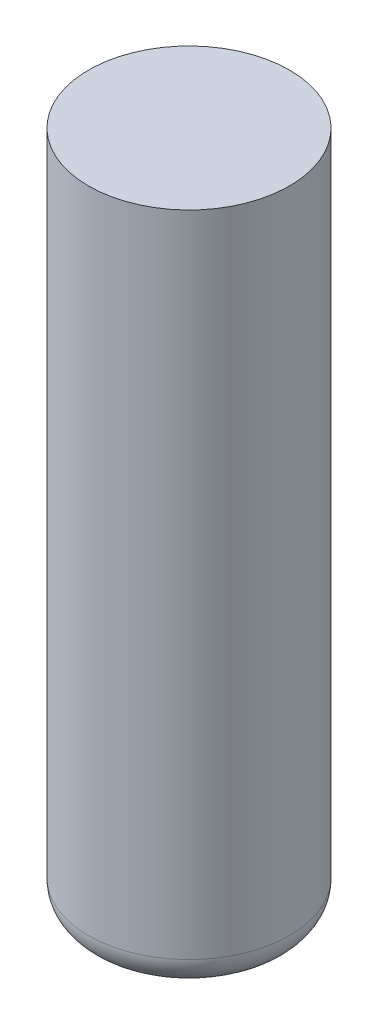
ISO-10303-21;
HEADER;
FILE_DESCRIPTION(('STEP AP214'),'2;1');
FILE_NAME('part.step','',(''),(''),'','','');
FILE_SCHEMA(('AUTOMOTIVE_DESIGN { 1 0 10303 214 1 1 1 1 }'));
ENDSEC;
DATA;
#1=APPLICATION_CONTEXT('core data for automotive mechanical design processes');
#2=APPLICATION_PROTOCOL_DEFINITION('international standard','automotive_design',2000,#1);
#3=PRODUCT_CONTEXT('',#1,'mechanical');
#4=PRODUCT('Part','Part','',(#3));
#5=PRODUCT_RELATED_PRODUCT_CATEGORY('part','',(#4));
#6=PRODUCT_DEFINITION_FORMATION('','',#4);
#7=PRODUCT_DEFINITION_CONTEXT('part definition',#1,'design');
#8=PRODUCT_DEFINITION('design','',#6,#7);
#9=PRODUCT_DEFINITION_SHAPE('','',#8);
#10=(LENGTH_UNIT() NAMED_UNIT(*) SI_UNIT(.MILLI.,.METRE.));
#11=(NAMED_UNIT(*) PLANE_ANGLE_UNIT() SI_UNIT($,.RADIAN.));
#12=(NAMED_UNIT(*) SI_UNIT($,.STERADIAN.) SOLID_ANGLE_UNIT());
#13=UNCERTAINTY_MEASURE_WITH_UNIT(LENGTH_MEASURE(1.E-05),#10,'distance_accuracy_value','');
#14=(GEOMETRIC_REPRESENTATION_CONTEXT(3) GLOBAL_UNCERTAINTY_ASSIGNED_CONTEXT((#13)) GLOBAL_UNIT_ASSIGNED_CONTEXT((#10,
#11,#12)) REPRESENTATION_CONTEXT('',''));
#15=CARTESIAN_POINT('',(0.,0.,0.));
#16=DIRECTION('',(0.,0.,1.));
#17=DIRECTION('',(1.,0.,0.));
#18=AXIS2_PLACEMENT_3D('',#15,#16,#17);
#19=CARTESIAN_POINT('',(0.,220.,0.));
#20=DIRECTION('',(0.,-1.,0.));
#21=DIRECTION('',(0.,0.,-1.));
#22=AXIS2_PLACEMENT_3D('',#19,#20,#21);
#23=CYLINDRICAL_SURFACE('',#22,32.5);
#24=CARTESIAN_POINT('',(0.,10.,0.));
#25=DIRECTION('',(0.,1.,0.));
#26=DIRECTION('',(0.,0.,1.));
#27=AXIS2_PLACEMENT_3D('',#24,#25,#26);
#28=CIRCLE('',#27,32.5);
#29=CARTESIAN_POINT('',(0.,10.,32.5));
#30=VERTEX_POINT('',#29);
#31=EDGE_CURVE('E51',#30,#30,#28,.T.);
#32=ORIENTED_EDGE('',*,*,#31,.T.);
#33=EDGE_LOOP('',(#32));
#34=FACE_BOUND('',#33,.T.);
#35=CARTESIAN_POINT('',(0.,220.,0.));
#36=DIRECTION('',(0.,1.,0.));
#37=DIRECTION('',(0.,0.,1.));
#38=AXIS2_PLACEMENT_3D('',#35,#36,#37);
#39=CIRCLE('',#38,32.5);
#40=CARTESIAN_POINT('',(0.,220.,32.5));
#41=VERTEX_POINT('',#40);
#42=EDGE_CURVE('E56',#41,#41,#39,.T.);
#43=ORIENTED_EDGE('',*,*,#42,.F.);
#44=EDGE_LOOP('',(#43));
#45=FACE_BOUND('',#44,.T.);
#46=ADVANCED_FACE('F43',(#34,#45),#23,.T.);
#47=CARTESIAN_POINT('',(0.,220.,0.));
#48=DIRECTION('',(0.,1.,0.));
#49=DIRECTION('',(0.,0.,1.));
#50=AXIS2_PLACEMENT_3D('',#47,#48,#49);
#51=PLANE('',#50);
#52=ORIENTED_EDGE('',*,*,#42,.T.);
#53=EDGE_LOOP('',(#52));
#54=FACE_BOUND('',#53,.T.);
#55=ADVANCED_FACE('F64',(#54),#51,.T.);
#56=CARTESIAN_POINT('',(0.,0.,0.));
#57=DIRECTION('',(0.,1.,0.));
#58=DIRECTION('',(0.,0.,1.));
#59=AXIS2_PLACEMENT_3D('',#56,#57,#58);
#60=PLANE('',#59);
#61=CARTESIAN_POINT('',(0.,0.,0.));
#62=DIRECTION('',(0.,1.,0.));
#63=DIRECTION('',(0.,0.,1.));
#64=AXIS2_PLACEMENT_3D('',#61,#62,#63);
#65=CIRCLE('',#64,22.5);
#66=CARTESIAN_POINT('',(0.,0.,22.5));
#67=VERTEX_POINT('',#66);
#68=EDGE_CURVE('E10',#67,#67,#65,.F.);
#69=ORIENTED_EDGE('',*,*,#68,.T.);
#70=EDGE_LOOP('',(#69));
#71=FACE_BOUND('',#70,.T.);
#72=ADVANCED_FACE('F71',(#71),#60,.F.);
#73=CARTESIAN_POINT('',(0.,10.,0.));
#74=DIRECTION('',(0.,1.,0.));
#75=DIRECTION('',(0.,0.,1.));
#76=AXIS2_PLACEMENT_3D('',#73,#74,#75);
#77=TOROIDAL_SURFACE('',#76,22.5,10.);
#78=ORIENTED_EDGE('',*,*,#68,.F.);
#79=EDGE_LOOP('',(#78));
#80=FACE_BOUND('',#79,.T.);
#81=ORIENTED_EDGE('',*,*,#31,.F.);
#82=EDGE_LOOP('',(#81));
#83=FACE_BOUND('',#82,.T.);
#84=ADVANCED_FACE('F45',(#80,#83),#77,.T.);
#85=CLOSED_SHELL('',(#46,#55,#72,#84));
#86=MANIFOLD_SOLID_BREP('B2',#85);
#87=ADVANCED_BREP_SHAPE_REPRESENTATION('',(#18,#86),#14);
#88=SHAPE_DEFINITION_REPRESENTATION(#9,#87);
ENDSEC;
END-ISO-10303-21;
